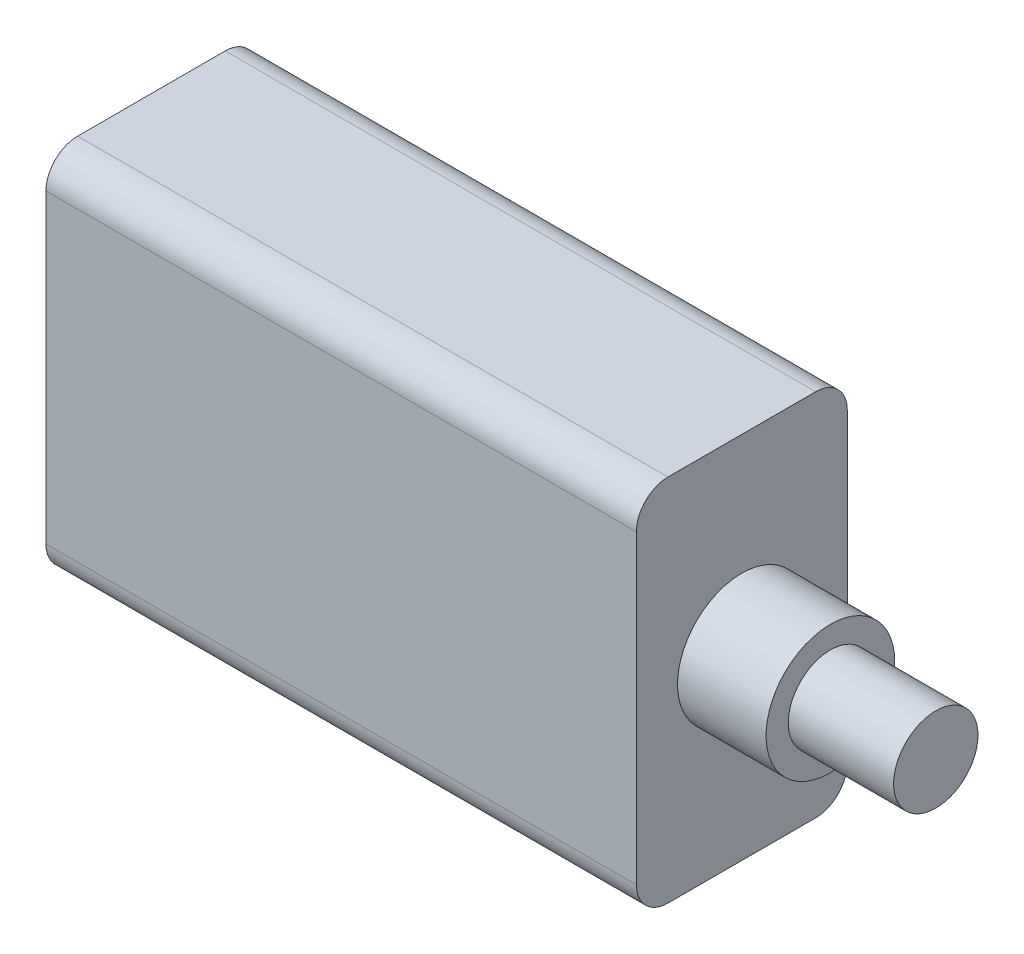
ISO-10303-21;
HEADER;
FILE_DESCRIPTION(('STEP AP214'),'2;1');
FILE_NAME('part.step','',(''),(''),'','','');
FILE_SCHEMA(('AUTOMOTIVE_DESIGN { 1 0 10303 214 1 1 1 1 }'));
ENDSEC;
DATA;
#1=APPLICATION_CONTEXT('core data for automotive mechanical design processes');
#2=APPLICATION_PROTOCOL_DEFINITION('international standard','automotive_design',2000,#1);
#3=PRODUCT_CONTEXT('',#1,'mechanical');
#4=PRODUCT('Part','Part','',(#3));
#5=PRODUCT_RELATED_PRODUCT_CATEGORY('part','',(#4));
#6=PRODUCT_DEFINITION_FORMATION('','',#4);
#7=PRODUCT_DEFINITION_CONTEXT('part definition',#1,'design');
#8=PRODUCT_DEFINITION('design','',#6,#7);
#9=PRODUCT_DEFINITION_SHAPE('','',#8);
#10=(LENGTH_UNIT() NAMED_UNIT(*) SI_UNIT(.MILLI.,.METRE.));
#11=(NAMED_UNIT(*) PLANE_ANGLE_UNIT() SI_UNIT($,.RADIAN.));
#12=(NAMED_UNIT(*) SI_UNIT($,.STERADIAN.) SOLID_ANGLE_UNIT());
#13=UNCERTAINTY_MEASURE_WITH_UNIT(LENGTH_MEASURE(1.E-05),#10,'distance_accuracy_value','');
#14=(GEOMETRIC_REPRESENTATION_CONTEXT(3) GLOBAL_UNCERTAINTY_ASSIGNED_CONTEXT((#13)) GLOBAL_UNIT_ASSIGNED_CONTEXT((#10,
#11,#12)) REPRESENTATION_CONTEXT('',''));
#15=CARTESIAN_POINT('',(0.,0.,0.));
#16=DIRECTION('',(0.,0.,1.));
#17=DIRECTION('',(1.,0.,0.));
#18=AXIS2_PLACEMENT_3D('',#15,#16,#17);
#19=CARTESIAN_POINT('',(0.,0.,10.));
#20=DIRECTION('',(1.,0.,0.));
#21=DIRECTION('',(0.,0.,-1.));
#22=AXIS2_PLACEMENT_3D('',#19,#20,#21);
#23=PLANE('',#22);
#24=DIRECTION('',(0.,0.,-1.));
#25=VECTOR('',#24,1.);
#26=CARTESIAN_POINT('',(0.,14.75,2.7));
#27=LINE('',#26,#25);
#28=CARTESIAN_POINT('',(0.,14.75,7.3));
#29=VERTEX_POINT('',#28);
#30=CARTESIAN_POINT('',(0.,14.75,2.7));
#31=VERTEX_POINT('',#30);
#32=EDGE_CURVE('E178',#29,#31,#27,.T.);
#33=ORIENTED_EDGE('',*,*,#32,.F.);
#34=DIRECTION('',(0.,1.,0.));
#35=VECTOR('',#34,1.);
#36=CARTESIAN_POINT('',(0.,14.75,7.3));
#37=LINE('',#36,#35);
#38=CARTESIAN_POINT('',(0.,2.75000000000001,7.3));
#39=VERTEX_POINT('',#38);
#40=EDGE_CURVE('E142',#39,#29,#37,.T.);
#41=ORIENTED_EDGE('',*,*,#40,.F.);
#42=DIRECTION('',(0.,0.,1.));
#43=VECTOR('',#42,1.);
#44=CARTESIAN_POINT('',(0.,2.75000000000001,2.7));
#45=LINE('',#44,#43);
#46=CARTESIAN_POINT('',(0.,2.75000000000001,2.7));
#47=VERTEX_POINT('',#46);
#48=EDGE_CURVE('E162',#47,#39,#45,.T.);
#49=ORIENTED_EDGE('',*,*,#48,.F.);
#50=DIRECTION('',(0.,-1.,0.));
#51=VECTOR('',#50,1.);
#52=CARTESIAN_POINT('',(0.,14.75,2.7));
#53=LINE('',#52,#51);
#54=EDGE_CURVE('E166',#31,#47,#53,.T.);
#55=ORIENTED_EDGE('',*,*,#54,.F.);
#56=EDGE_LOOP('',(#33,#41,#49,#55));
#57=FACE_BOUND('',#56,.T.);
#58=DIRECTION('',(0.,0.,-1.));
#59=VECTOR('',#58,1.);
#60=CARTESIAN_POINT('',(0.,17.5,10.));
#61=LINE('',#60,#59);
#62=CARTESIAN_POINT('',(0.,17.5,8.5));
#63=VERTEX_POINT('',#62);
#64=CARTESIAN_POINT('',(0.,17.5,1.5));
#65=VERTEX_POINT('',#64);
#66=EDGE_CURVE('E203',#63,#65,#61,.T.);
#67=ORIENTED_EDGE('',*,*,#66,.T.);
#68=CARTESIAN_POINT('',(0.,16.,1.5));
#69=DIRECTION('',(1.,0.,0.));
#70=DIRECTION('',(0.,0.,-1.));
#71=AXIS2_PLACEMENT_3D('',#68,#69,#70);
#72=CIRCLE('',#71,1.5);
#73=CARTESIAN_POINT('',(0.,16.,0.));
#74=VERTEX_POINT('',#73);
#75=EDGE_CURVE('E241',#65,#74,#72,.F.);
#76=ORIENTED_EDGE('',*,*,#75,.T.);
#77=DIRECTION('',(0.,-1.,0.));
#78=VECTOR('',#77,1.);
#79=CARTESIAN_POINT('',(0.,0.,0.));
#80=LINE('',#79,#78);
#81=CARTESIAN_POINT('',(0.,1.5,0.));
#82=VERTEX_POINT('',#81);
#83=EDGE_CURVE('E188',#74,#82,#80,.T.);
#84=ORIENTED_EDGE('',*,*,#83,.T.);
#85=CARTESIAN_POINT('',(0.,1.5,1.5));
#86=DIRECTION('',(1.,0.,0.));
#87=DIRECTION('',(0.,0.,-1.));
#88=AXIS2_PLACEMENT_3D('',#85,#86,#87);
#89=CIRCLE('',#88,1.5);
#90=CARTESIAN_POINT('',(0.,0.,1.5));
#91=VERTEX_POINT('',#90);
#92=EDGE_CURVE('E238',#82,#91,#89,.F.);
#93=ORIENTED_EDGE('',*,*,#92,.T.);
#94=DIRECTION('',(0.,0.,-1.));
#95=VECTOR('',#94,1.);
#96=CARTESIAN_POINT('',(0.,0.,10.));
#97=LINE('',#96,#95);
#98=CARTESIAN_POINT('',(0.,0.,8.5));
#99=VERTEX_POINT('',#98);
#100=EDGE_CURVE('E220',#99,#91,#97,.T.);
#101=ORIENTED_EDGE('',*,*,#100,.F.);
#102=CARTESIAN_POINT('',(0.,1.5,8.5));
#103=DIRECTION('',(1.,0.,0.));
#104=DIRECTION('',(0.,0.,-1.));
#105=AXIS2_PLACEMENT_3D('',#102,#103,#104);
#106=CIRCLE('',#105,1.5);
#107=CARTESIAN_POINT('',(0.,1.5,10.));
#108=VERTEX_POINT('',#107);
#109=EDGE_CURVE('E235',#99,#108,#106,.F.);
#110=ORIENTED_EDGE('',*,*,#109,.T.);
#111=DIRECTION('',(0.,-1.,0.));
#112=VECTOR('',#111,1.);
#113=CARTESIAN_POINT('',(0.,0.,10.));
#114=LINE('',#113,#112);
#115=CARTESIAN_POINT('',(0.,16.,10.));
#116=VERTEX_POINT('',#115);
#117=EDGE_CURVE('E194',#116,#108,#114,.T.);
#118=ORIENTED_EDGE('',*,*,#117,.F.);
#119=CARTESIAN_POINT('',(0.,16.,8.5));
#120=DIRECTION('',(1.,0.,0.));
#121=DIRECTION('',(0.,0.,-1.));
#122=AXIS2_PLACEMENT_3D('',#119,#120,#121);
#123=CIRCLE('',#122,1.5);
#124=EDGE_CURVE('E232',#116,#63,#123,.F.);
#125=ORIENTED_EDGE('',*,*,#124,.T.);
#126=EDGE_LOOP('',(#67,#76,#84,#93,#101,#110,#118,#125));
#127=FACE_BOUND('',#126,.T.);
#128=ADVANCED_FACE('F43',(#57,#127),#23,.F.);
#129=CARTESIAN_POINT('',(0.,0.,10.));
#130=DIRECTION('',(0.,1.,0.));
#131=DIRECTION('',(0.,0.,1.));
#132=AXIS2_PLACEMENT_3D('',#129,#130,#131);
#133=PLANE('',#132);
#134=ORIENTED_EDGE('',*,*,#100,.T.);
#135=DIRECTION('',(1.,0.,0.));
#136=VECTOR('',#135,1.);
#137=CARTESIAN_POINT('',(28.,0.,1.5));
#138=LINE('',#137,#136);
#139=CARTESIAN_POINT('',(28.,0.,1.5));
#140=VERTEX_POINT('',#139);
#141=EDGE_CURVE('E263',#91,#140,#138,.T.);
#142=ORIENTED_EDGE('',*,*,#141,.T.);
#143=DIRECTION('',(0.,0.,-1.));
#144=VECTOR('',#143,1.);
#145=CARTESIAN_POINT('',(28.,0.,10.));
#146=LINE('',#145,#144);
#147=CARTESIAN_POINT('',(28.,0.,8.5));
#148=VERTEX_POINT('',#147);
#149=EDGE_CURVE('E217',#148,#140,#146,.T.);
#150=ORIENTED_EDGE('',*,*,#149,.F.);
#151=DIRECTION('',(1.,0.,0.));
#152=VECTOR('',#151,1.);
#153=CARTESIAN_POINT('',(0.,0.,8.5));
#154=LINE('',#153,#152);
#155=EDGE_CURVE('E260',#148,#99,#154,.F.);
#156=ORIENTED_EDGE('',*,*,#155,.T.);
#157=EDGE_LOOP('',(#134,#142,#150,#156));
#158=FACE_BOUND('',#157,.T.);
#159=ADVANCED_FACE('F298',(#158),#133,.F.);
#160=CARTESIAN_POINT('',(28.,0.,10.));
#161=DIRECTION('',(-1.,0.,0.));
#162=DIRECTION('',(0.,0.,1.));
#163=AXIS2_PLACEMENT_3D('',#160,#161,#162);
#164=PLANE('',#163);
#165=CARTESIAN_POINT('',(28.,8.75,5.));
#166=DIRECTION('',(1.,0.,0.));
#167=DIRECTION('',(0.,0.,-1.));
#168=AXIS2_PLACEMENT_3D('',#165,#166,#167);
#169=CIRCLE('',#168,3.05);
#170=CARTESIAN_POINT('',(28.,8.75,1.95));
#171=VERTEX_POINT('',#170);
#172=EDGE_CURVE('E169',#171,#171,#169,.T.);
#173=ORIENTED_EDGE('',*,*,#172,.F.);
#174=EDGE_LOOP('',(#173));
#175=FACE_BOUND('',#174,.T.);
#176=DIRECTION('',(0.,1.,0.));
#177=VECTOR('',#176,1.);
#178=CARTESIAN_POINT('',(28.,0.,0.));
#179=LINE('',#178,#177);
#180=CARTESIAN_POINT('',(28.,1.5,0.));
#181=VERTEX_POINT('',#180);
#182=CARTESIAN_POINT('',(28.,16.,0.));
#183=VERTEX_POINT('',#182);
#184=EDGE_CURVE('E199',#181,#183,#179,.T.);
#185=ORIENTED_EDGE('',*,*,#184,.T.);
#186=CARTESIAN_POINT('',(28.,16.,1.5));
#187=DIRECTION('',(-1.,0.,0.));
#188=DIRECTION('',(0.,0.,1.));
#189=AXIS2_PLACEMENT_3D('',#186,#187,#188);
#190=CIRCLE('',#189,1.5);
#191=CARTESIAN_POINT('',(28.,17.5,1.5));
#192=VERTEX_POINT('',#191);
#193=EDGE_CURVE('E257',#183,#192,#190,.F.);
#194=ORIENTED_EDGE('',*,*,#193,.T.);
#195=DIRECTION('',(0.,0.,-1.));
#196=VECTOR('',#195,1.);
#197=CARTESIAN_POINT('',(28.,17.5,10.));
#198=LINE('',#197,#196);
#199=CARTESIAN_POINT('',(28.,17.5,8.5));
#200=VERTEX_POINT('',#199);
#201=EDGE_CURVE('E213',#200,#192,#198,.T.);
#202=ORIENTED_EDGE('',*,*,#201,.F.);
#203=CARTESIAN_POINT('',(28.,16.,8.5));
#204=DIRECTION('',(-1.,0.,0.));
#205=DIRECTION('',(0.,0.,1.));
#206=AXIS2_PLACEMENT_3D('',#203,#204,#205);
#207=CIRCLE('',#206,1.5);
#208=CARTESIAN_POINT('',(28.,16.,10.));
#209=VERTEX_POINT('',#208);
#210=EDGE_CURVE('E250',#200,#209,#207,.F.);
#211=ORIENTED_EDGE('',*,*,#210,.T.);
#212=DIRECTION('',(0.,1.,0.));
#213=VECTOR('',#212,1.);
#214=CARTESIAN_POINT('',(28.,0.,10.));
#215=LINE('',#214,#213);
#216=CARTESIAN_POINT('',(28.,1.5,10.));
#217=VERTEX_POINT('',#216);
#218=EDGE_CURVE('E198',#217,#209,#215,.T.);
#219=ORIENTED_EDGE('',*,*,#218,.F.);
#220=CARTESIAN_POINT('',(28.,1.5,8.5));
#221=DIRECTION('',(-1.,0.,0.));
#222=DIRECTION('',(0.,0.,1.));
#223=AXIS2_PLACEMENT_3D('',#220,#221,#222);
#224=CIRCLE('',#223,1.5);
#225=EDGE_CURVE('E67',#217,#148,#224,.F.);
#226=ORIENTED_EDGE('',*,*,#225,.T.);
#227=ORIENTED_EDGE('',*,*,#149,.T.);
#228=CARTESIAN_POINT('',(28.,1.5,1.5));
#229=DIRECTION('',(-1.,0.,0.));
#230=DIRECTION('',(0.,0.,1.));
#231=AXIS2_PLACEMENT_3D('',#228,#229,#230);
#232=CIRCLE('',#231,1.5);
#233=EDGE_CURVE('E59',#140,#181,#232,.F.);
#234=ORIENTED_EDGE('',*,*,#233,.T.);
#235=EDGE_LOOP('',(#185,#194,#202,#211,#219,#226,#227,#234));
#236=FACE_BOUND('',#235,.T.);
#237=ADVANCED_FACE('F281',(#175,#236),#164,.F.);
#238=CARTESIAN_POINT('',(0.,17.5,10.));
#239=DIRECTION('',(0.,-1.,0.));
#240=DIRECTION('',(1.,0.,0.));
#241=AXIS2_PLACEMENT_3D('',#238,#239,#240);
#242=PLANE('',#241);
#243=ORIENTED_EDGE('',*,*,#201,.T.);
#244=DIRECTION('',(-1.,0.,0.));
#245=VECTOR('',#244,1.);
#246=CARTESIAN_POINT('',(0.,17.5,1.5));
#247=LINE('',#246,#245);
#248=EDGE_CURVE('E227',#192,#65,#247,.T.);
#249=ORIENTED_EDGE('',*,*,#248,.T.);
#250=ORIENTED_EDGE('',*,*,#66,.F.);
#251=DIRECTION('',(-1.,0.,0.));
#252=VECTOR('',#251,1.);
#253=CARTESIAN_POINT('',(0.,17.5,8.5));
#254=LINE('',#253,#252);
#255=EDGE_CURVE('E224',#63,#200,#254,.F.);
#256=ORIENTED_EDGE('',*,*,#255,.T.);
#257=EDGE_LOOP('',(#243,#249,#250,#256));
#258=FACE_BOUND('',#257,.T.);
#259=ADVANCED_FACE('F285',(#258),#242,.F.);
#260=CARTESIAN_POINT('',(0.,0.,10.));
#261=DIRECTION('',(0.,0.,-1.));
#262=DIRECTION('',(-1.,0.,0.));
#263=AXIS2_PLACEMENT_3D('',#260,#261,#262);
#264=PLANE('',#263);
#265=ORIENTED_EDGE('',*,*,#117,.T.);
#266=DIRECTION('',(1.,0.,0.));
#267=VECTOR('',#266,1.);
#268=CARTESIAN_POINT('',(0.,1.5,10.));
#269=LINE('',#268,#267);
#270=EDGE_CURVE('E11',#108,#217,#269,.T.);
#271=ORIENTED_EDGE('',*,*,#270,.T.);
#272=ORIENTED_EDGE('',*,*,#218,.T.);
#273=DIRECTION('',(-1.,0.,0.));
#274=VECTOR('',#273,1.);
#275=CARTESIAN_POINT('',(0.,16.,10.));
#276=LINE('',#275,#274);
#277=EDGE_CURVE('E52',#209,#116,#276,.T.);
#278=ORIENTED_EDGE('',*,*,#277,.T.);
#279=EDGE_LOOP('',(#265,#271,#272,#278));
#280=FACE_BOUND('',#279,.T.);
#281=ADVANCED_FACE('F270',(#280),#264,.F.);
#282=CARTESIAN_POINT('',(0.,0.,0.));
#283=DIRECTION('',(0.,0.,-1.));
#284=DIRECTION('',(-1.,0.,0.));
#285=AXIS2_PLACEMENT_3D('',#282,#283,#284);
#286=PLANE('',#285);
#287=ORIENTED_EDGE('',*,*,#83,.F.);
#288=DIRECTION('',(-1.,0.,0.));
#289=VECTOR('',#288,1.);
#290=CARTESIAN_POINT('',(28.,16.,0.));
#291=LINE('',#290,#289);
#292=EDGE_CURVE('E247',#74,#183,#291,.F.);
#293=ORIENTED_EDGE('',*,*,#292,.T.);
#294=ORIENTED_EDGE('',*,*,#184,.F.);
#295=DIRECTION('',(1.,0.,0.));
#296=VECTOR('',#295,1.);
#297=CARTESIAN_POINT('',(0.,1.5,0.));
#298=LINE('',#297,#296);
#299=EDGE_CURVE('E244',#181,#82,#298,.F.);
#300=ORIENTED_EDGE('',*,*,#299,.T.);
#301=EDGE_LOOP('',(#287,#293,#294,#300));
#302=FACE_BOUND('',#301,.T.);
#303=ADVANCED_FACE('F292',(#302),#286,.T.);
#304=CARTESIAN_POINT('',(8.6,14.75,7.3));
#305=DIRECTION('',(0.,0.,1.));
#306=DIRECTION('',(1.,0.,0.));
#307=AXIS2_PLACEMENT_3D('',#304,#305,#306);
#308=PLANE('',#307);
#309=ORIENTED_EDGE('',*,*,#40,.T.);
#310=DIRECTION('',(-1.,0.,0.));
#311=VECTOR('',#310,1.);
#312=CARTESIAN_POINT('',(8.6,14.75,7.3));
#313=LINE('',#312,#311);
#314=CARTESIAN_POINT('',(8.6,14.75,7.3));
#315=VERTEX_POINT('',#314);
#316=EDGE_CURVE('E135',#315,#29,#313,.T.);
#317=ORIENTED_EDGE('',*,*,#316,.F.);
#318=DIRECTION('',(0.,1.,0.));
#319=VECTOR('',#318,1.);
#320=CARTESIAN_POINT('',(8.6,14.75,7.3));
#321=LINE('',#320,#319);
#322=CARTESIAN_POINT('',(8.6,2.75000000000001,7.3));
#323=VERTEX_POINT('',#322);
#324=EDGE_CURVE('E139',#323,#315,#321,.T.);
#325=ORIENTED_EDGE('',*,*,#324,.F.);
#326=DIRECTION('',(-1.,0.,0.));
#327=VECTOR('',#326,1.);
#328=CARTESIAN_POINT('',(8.6,2.75000000000001,7.3));
#329=LINE('',#328,#327);
#330=EDGE_CURVE('E185',#323,#39,#329,.T.);
#331=ORIENTED_EDGE('',*,*,#330,.T.);
#332=EDGE_LOOP('',(#309,#317,#325,#331));
#333=FACE_BOUND('',#332,.T.);
#334=ADVANCED_FACE('F137',(#333),#308,.F.);
#335=CARTESIAN_POINT('',(8.6,2.75000000000001,2.7));
#336=DIRECTION('',(0.,-1.,0.));
#337=DIRECTION('',(0.,0.,-1.));
#338=AXIS2_PLACEMENT_3D('',#335,#336,#337);
#339=PLANE('',#338);
#340=ORIENTED_EDGE('',*,*,#48,.T.);
#341=ORIENTED_EDGE('',*,*,#330,.F.);
#342=DIRECTION('',(0.,0.,1.));
#343=VECTOR('',#342,1.);
#344=CARTESIAN_POINT('',(8.6,2.75000000000001,2.7));
#345=LINE('',#344,#343);
#346=CARTESIAN_POINT('',(8.6,2.75000000000001,2.7));
#347=VERTEX_POINT('',#346);
#348=EDGE_CURVE('E148',#347,#323,#345,.T.);
#349=ORIENTED_EDGE('',*,*,#348,.F.);
#350=DIRECTION('',(-1.,0.,0.));
#351=VECTOR('',#350,1.);
#352=CARTESIAN_POINT('',(8.6,2.75000000000001,2.7));
#353=LINE('',#352,#351);
#354=EDGE_CURVE('E189',#347,#47,#353,.T.);
#355=ORIENTED_EDGE('',*,*,#354,.T.);
#356=EDGE_LOOP('',(#340,#341,#349,#355));
#357=FACE_BOUND('',#356,.T.);
#358=ADVANCED_FACE('F459',(#357),#339,.F.);
#359=CARTESIAN_POINT('',(8.6,14.75,2.7));
#360=DIRECTION('',(0.,0.,-1.));
#361=DIRECTION('',(0.,1.,0.));
#362=AXIS2_PLACEMENT_3D('',#359,#360,#361);
#363=PLANE('',#362);
#364=ORIENTED_EDGE('',*,*,#54,.T.);
#365=ORIENTED_EDGE('',*,*,#354,.F.);
#366=DIRECTION('',(0.,-1.,0.));
#367=VECTOR('',#366,1.);
#368=CARTESIAN_POINT('',(8.6,14.75,2.7));
#369=LINE('',#368,#367);
#370=CARTESIAN_POINT('',(8.6,14.75,2.7));
#371=VERTEX_POINT('',#370);
#372=EDGE_CURVE('E157',#371,#347,#369,.T.);
#373=ORIENTED_EDGE('',*,*,#372,.F.);
#374=DIRECTION('',(-1.,0.,0.));
#375=VECTOR('',#374,1.);
#376=CARTESIAN_POINT('',(8.6,14.75,2.7));
#377=LINE('',#376,#375);
#378=EDGE_CURVE('E147',#371,#31,#377,.T.);
#379=ORIENTED_EDGE('',*,*,#378,.T.);
#380=EDGE_LOOP('',(#364,#365,#373,#379));
#381=FACE_BOUND('',#380,.T.);
#382=ADVANCED_FACE('F449',(#381),#363,.F.);
#383=CARTESIAN_POINT('',(8.6,14.75,2.7));
#384=DIRECTION('',(0.,1.,0.));
#385=DIRECTION('',(0.,0.,1.));
#386=AXIS2_PLACEMENT_3D('',#383,#384,#385);
#387=PLANE('',#386);
#388=ORIENTED_EDGE('',*,*,#32,.T.);
#389=ORIENTED_EDGE('',*,*,#378,.F.);
#390=DIRECTION('',(0.,0.,-1.));
#391=VECTOR('',#390,1.);
#392=CARTESIAN_POINT('',(8.6,14.75,2.7));
#393=LINE('',#392,#391);
#394=EDGE_CURVE('E151',#315,#371,#393,.T.);
#395=ORIENTED_EDGE('',*,*,#394,.F.);
#396=ORIENTED_EDGE('',*,*,#316,.T.);
#397=EDGE_LOOP('',(#388,#389,#395,#396));
#398=FACE_BOUND('',#397,.T.);
#399=ADVANCED_FACE('F152',(#398),#387,.F.);
#400=CARTESIAN_POINT('',(8.6,0.,0.));
#401=DIRECTION('',(-1.,0.,0.));
#402=DIRECTION('',(0.,0.,1.));
#403=AXIS2_PLACEMENT_3D('',#400,#401,#402);
#404=PLANE('',#403);
#405=ORIENTED_EDGE('',*,*,#324,.T.);
#406=ORIENTED_EDGE('',*,*,#394,.T.);
#407=ORIENTED_EDGE('',*,*,#372,.T.);
#408=ORIENTED_EDGE('',*,*,#348,.T.);
#409=EDGE_LOOP('',(#405,#406,#407,#408));
#410=FACE_BOUND('',#409,.T.);
#411=ADVANCED_FACE('F159',(#410),#404,.T.);
#412=CARTESIAN_POINT('',(32.2,8.75,5.));
#413=DIRECTION('',(-1.,0.,0.));
#414=DIRECTION('',(0.,0.,1.));
#415=AXIS2_PLACEMENT_3D('',#412,#413,#414);
#416=CYLINDRICAL_SURFACE('',#415,3.05);
#417=CARTESIAN_POINT('',(32.2,8.75,5.));
#418=DIRECTION('',(1.,0.,0.));
#419=DIRECTION('',(0.,0.,-1.));
#420=AXIS2_PLACEMENT_3D('',#417,#418,#419);
#421=CIRCLE('',#420,3.05);
#422=CARTESIAN_POINT('',(32.2,8.75,1.95));
#423=VERTEX_POINT('',#422);
#424=EDGE_CURVE('E179',#423,#423,#421,.T.);
#425=ORIENTED_EDGE('',*,*,#424,.F.);
#426=EDGE_LOOP('',(#425));
#427=FACE_BOUND('',#426,.T.);
#428=ORIENTED_EDGE('',*,*,#172,.T.);
#429=EDGE_LOOP('',(#428));
#430=FACE_BOUND('',#429,.T.);
#431=ADVANCED_FACE('F419',(#427,#430),#416,.T.);
#432=CARTESIAN_POINT('',(32.2,8.75,5.));
#433=DIRECTION('',(1.,0.,0.));
#434=DIRECTION('',(0.,0.,-1.));
#435=AXIS2_PLACEMENT_3D('',#432,#433,#434);
#436=PLANE('',#435);
#437=CARTESIAN_POINT('',(32.2,8.75,5.));
#438=DIRECTION('',(1.,0.,0.));
#439=DIRECTION('',(0.,0.,-1.));
#440=AXIS2_PLACEMENT_3D('',#437,#438,#439);
#441=CIRCLE('',#440,2.);
#442=CARTESIAN_POINT('',(32.2,8.75,3.));
#443=VERTEX_POINT('',#442);
#444=EDGE_CURVE('E228',#443,#443,#441,.T.);
#445=ORIENTED_EDGE('',*,*,#444,.F.);
#446=EDGE_LOOP('',(#445));
#447=FACE_BOUND('',#446,.T.);
#448=ORIENTED_EDGE('',*,*,#424,.T.);
#449=EDGE_LOOP('',(#448));
#450=FACE_BOUND('',#449,.T.);
#451=ADVANCED_FACE('F408',(#447,#450),#436,.T.);
#452=CARTESIAN_POINT('',(37.2,8.75,5.));
#453=DIRECTION('',(-1.,0.,0.));
#454=DIRECTION('',(0.,0.,1.));
#455=AXIS2_PLACEMENT_3D('',#452,#453,#454);
#456=CYLINDRICAL_SURFACE('',#455,2.);
#457=CARTESIAN_POINT('',(37.2,8.75,5.));
#458=DIRECTION('',(1.,0.,0.));
#459=DIRECTION('',(0.,0.,-1.));
#460=AXIS2_PLACEMENT_3D('',#457,#458,#459);
#461=CIRCLE('',#460,2.);
#462=CARTESIAN_POINT('',(37.2,8.75,3.));
#463=VERTEX_POINT('',#462);
#464=EDGE_CURVE('E515',#463,#463,#461,.T.);
#465=ORIENTED_EDGE('',*,*,#464,.F.);
#466=EDGE_LOOP('',(#465));
#467=FACE_BOUND('',#466,.T.);
#468=ORIENTED_EDGE('',*,*,#444,.T.);
#469=EDGE_LOOP('',(#468));
#470=FACE_BOUND('',#469,.T.);
#471=ADVANCED_FACE('F397',(#467,#470),#456,.T.);
#472=CARTESIAN_POINT('',(37.2,8.75,5.));
#473=DIRECTION('',(1.,0.,0.));
#474=DIRECTION('',(0.,0.,-1.));
#475=AXIS2_PLACEMENT_3D('',#472,#473,#474);
#476=PLANE('',#475);
#477=ORIENTED_EDGE('',*,*,#464,.T.);
#478=EDGE_LOOP('',(#477));
#479=FACE_BOUND('',#478,.T.);
#480=ADVANCED_FACE('F313',(#479),#476,.T.);
#481=CARTESIAN_POINT('',(0.,16.,1.5));
#482=DIRECTION('',(1.,0.,0.));
#483=DIRECTION('',(0.,1.,0.));
#484=AXIS2_PLACEMENT_3D('',#481,#482,#483);
#485=CYLINDRICAL_SURFACE('',#484,1.5);
#486=ORIENTED_EDGE('',*,*,#193,.F.);
#487=ORIENTED_EDGE('',*,*,#292,.F.);
#488=ORIENTED_EDGE('',*,*,#75,.F.);
#489=ORIENTED_EDGE('',*,*,#248,.F.);
#490=EDGE_LOOP('',(#486,#487,#488,#489));
#491=FACE_BOUND('',#490,.T.);
#492=ADVANCED_FACE('F295',(#491),#485,.T.);
#493=CARTESIAN_POINT('',(0.,1.5,1.5));
#494=DIRECTION('',(-1.,0.,0.));
#495=DIRECTION('',(0.,0.,1.));
#496=AXIS2_PLACEMENT_3D('',#493,#494,#495);
#497=CYLINDRICAL_SURFACE('',#496,1.5);
#498=ORIENTED_EDGE('',*,*,#92,.F.);
#499=ORIENTED_EDGE('',*,*,#299,.F.);
#500=ORIENTED_EDGE('',*,*,#233,.F.);
#501=ORIENTED_EDGE('',*,*,#141,.F.);
#502=EDGE_LOOP('',(#498,#499,#500,#501));
#503=FACE_BOUND('',#502,.T.);
#504=ADVANCED_FACE('F296',(#503),#497,.T.);
#505=CARTESIAN_POINT('',(0.,1.5,8.5));
#506=DIRECTION('',(1.,0.,0.));
#507=DIRECTION('',(0.,0.,-1.));
#508=AXIS2_PLACEMENT_3D('',#505,#506,#507);
#509=CYLINDRICAL_SURFACE('',#508,1.5);
#510=ORIENTED_EDGE('',*,*,#109,.F.);
#511=ORIENTED_EDGE('',*,*,#155,.F.);
#512=ORIENTED_EDGE('',*,*,#225,.F.);
#513=ORIENTED_EDGE('',*,*,#270,.F.);
#514=EDGE_LOOP('',(#510,#511,#512,#513));
#515=FACE_BOUND('',#514,.T.);
#516=ADVANCED_FACE('F280',(#515),#509,.T.);
#517=CARTESIAN_POINT('',(0.,16.,8.5));
#518=DIRECTION('',(-1.,0.,0.));
#519=DIRECTION('',(0.,-1.,0.));
#520=AXIS2_PLACEMENT_3D('',#517,#518,#519);
#521=CYLINDRICAL_SURFACE('',#520,1.5);
#522=ORIENTED_EDGE('',*,*,#210,.F.);
#523=ORIENTED_EDGE('',*,*,#255,.F.);
#524=ORIENTED_EDGE('',*,*,#124,.F.);
#525=ORIENTED_EDGE('',*,*,#277,.F.);
#526=EDGE_LOOP('',(#522,#523,#524,#525));
#527=FACE_BOUND('',#526,.T.);
#528=ADVANCED_FACE('F45',(#527),#521,.T.);
#529=CLOSED_SHELL('',(#128,#159,#237,#259,#281,#303,#334,#358,#382,#399,#411,#431,#451,#471,
#480,#492,#504,#516,#528));
#530=MANIFOLD_SOLID_BREP('B2',#529);
#531=ADVANCED_BREP_SHAPE_REPRESENTATION('',(#18,#530),#14);
#532=SHAPE_DEFINITION_REPRESENTATION(#9,#531);
ENDSEC;
END-ISO-10303-21;
